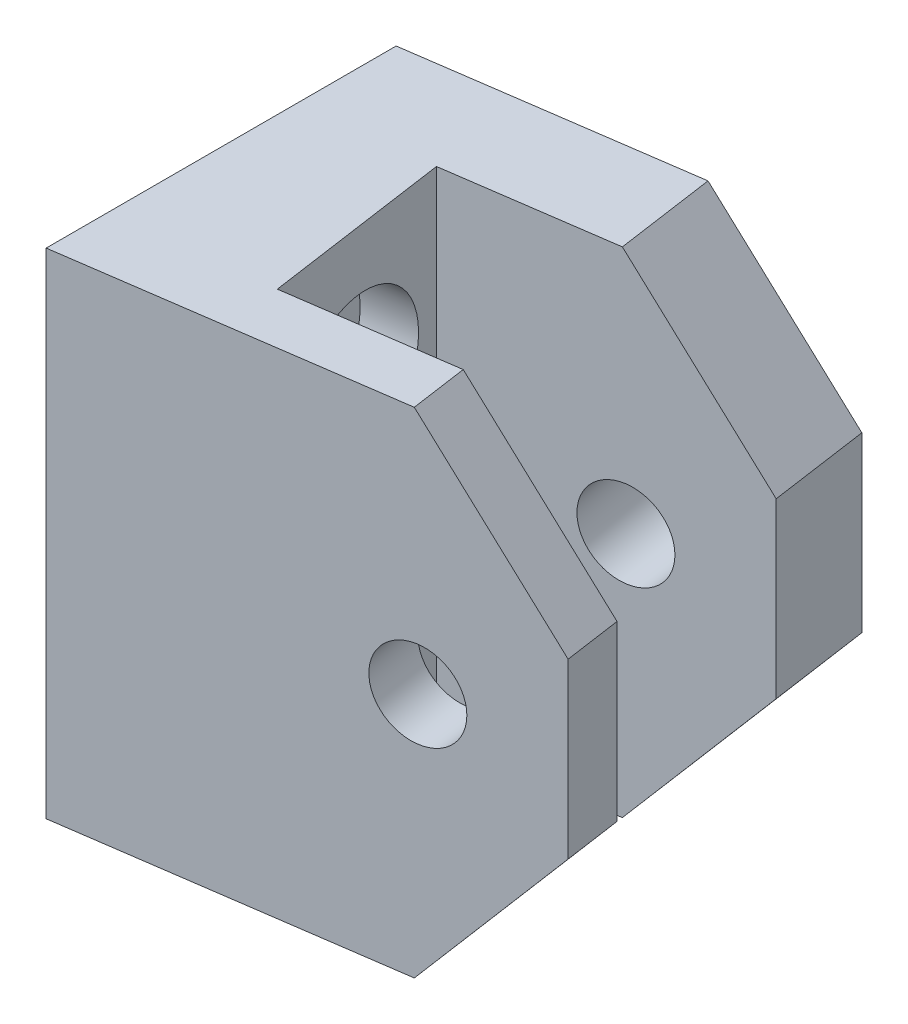
ISO-10303-21;
HEADER;
FILE_DESCRIPTION(('STEP AP214'),'2;1');
FILE_NAME('part.step','',(''),(''),'','','');
FILE_SCHEMA(('AUTOMOTIVE_DESIGN { 1 0 10303 214 1 1 1 1 }'));
ENDSEC;
DATA;
#1=APPLICATION_CONTEXT('core data for automotive mechanical design processes');
#2=APPLICATION_PROTOCOL_DEFINITION('international standard','automotive_design',2000,#1);
#3=PRODUCT_CONTEXT('',#1,'mechanical');
#4=PRODUCT('Part','Part','',(#3));
#5=PRODUCT_RELATED_PRODUCT_CATEGORY('part','',(#4));
#6=PRODUCT_DEFINITION_FORMATION('','',#4);
#7=PRODUCT_DEFINITION_CONTEXT('part definition',#1,'design');
#8=PRODUCT_DEFINITION('design','',#6,#7);
#9=PRODUCT_DEFINITION_SHAPE('','',#8);
#10=(LENGTH_UNIT() NAMED_UNIT(*) SI_UNIT(.MILLI.,.METRE.));
#11=(NAMED_UNIT(*) PLANE_ANGLE_UNIT() SI_UNIT($,.RADIAN.));
#12=(NAMED_UNIT(*) SI_UNIT($,.STERADIAN.) SOLID_ANGLE_UNIT());
#13=UNCERTAINTY_MEASURE_WITH_UNIT(LENGTH_MEASURE(1.E-05),#10,'distance_accuracy_value','');
#14=(GEOMETRIC_REPRESENTATION_CONTEXT(3) GLOBAL_UNCERTAINTY_ASSIGNED_CONTEXT((#13)) GLOBAL_UNIT_ASSIGNED_CONTEXT((#10,
#11,#12)) REPRESENTATION_CONTEXT('',''));
#15=CARTESIAN_POINT('',(0.,0.,0.));
#16=DIRECTION('',(0.,0.,1.));
#17=DIRECTION('',(1.,0.,0.));
#18=AXIS2_PLACEMENT_3D('',#15,#16,#17);
#19=CARTESIAN_POINT('',(-1.90500000579084,54.37886,33.9650340772844));
#20=DIRECTION('',(1.,0.,-8.04481674826941E-13));
#21=DIRECTION('',(-8.04481674826941E-13,0.,-1.));
#22=AXIS2_PLACEMENT_3D('',#19,#20,#21);
#23=PLANE('',#22);
#24=CARTESIAN_POINT('',(-1.9050000058044,39.88943,17.1191776297874));
#25=DIRECTION('',(1.,0.,-8.04481674826941E-13));
#26=DIRECTION('',(-8.04481674826941E-13,0.,-1.));
#27=AXIS2_PLACEMENT_3D('',#24,#25,#26);
#28=ELLIPSE('',#27,4.54608092387669,4.5);
#29=CARTESIAN_POINT('',(-1.90500000580805,39.88943,12.5730967059107));
#30=VERTEX_POINT('',#29);
#31=EDGE_CURVE('E49',#30,#30,#28,.T.);
#32=ORIENTED_EDGE('',*,*,#31,.T.);
#33=EDGE_LOOP('',(#32));
#34=FACE_BOUND('',#33,.T.);
#35=CARTESIAN_POINT('',(-1.9050000058044,14.48943,17.1191776297874));
#36=DIRECTION('',(1.,0.,-8.04481674826941E-13));
#37=DIRECTION('',(-8.04481674826941E-13,0.,-1.));
#38=AXIS2_PLACEMENT_3D('',#35,#36,#37);
#39=ELLIPSE('',#38,4.54608092387669,4.5);
#40=CARTESIAN_POINT('',(-1.90500000580805,14.48943,12.5730967059107));
#41=VERTEX_POINT('',#40);
#42=EDGE_CURVE('E211',#41,#41,#39,.T.);
#43=ORIENTED_EDGE('',*,*,#42,.T.);
#44=EDGE_LOOP('',(#43));
#45=FACE_BOUND('',#44,.T.);
#46=DIRECTION('',(8.04481674826941E-13,0.,1.));
#47=VECTOR('',#46,1.);
#48=CARTESIAN_POINT('',(-1.90500000579084,0.,33.9650340772844));
#49=LINE('',#48,#47);
#50=CARTESIAN_POINT('',(-1.90500000579084,0.,-4.5379477954834));
#51=VERTEX_POINT('',#50);
#52=CARTESIAN_POINT('',(-1.90500000579084,0.,33.9650340772844));
#53=VERTEX_POINT('',#52);
#54=EDGE_CURVE('E171',#51,#53,#49,.T.);
#55=ORIENTED_EDGE('',*,*,#54,.T.);
#56=DIRECTION('',(0.,-1.,0.));
#57=VECTOR('',#56,1.);
#58=CARTESIAN_POINT('',(-1.90500000579084,54.37886,33.9650340772844));
#59=LINE('',#58,#57);
#60=CARTESIAN_POINT('',(-1.90500000579084,54.37886,33.9650340772844));
#61=VERTEX_POINT('',#60);
#62=EDGE_CURVE('E203',#61,#53,#59,.T.);
#63=ORIENTED_EDGE('',*,*,#62,.F.);
#64=DIRECTION('',(0.,0.,1.));
#65=VECTOR('',#64,1.);
#66=CARTESIAN_POINT('',(-1.90500000579084,54.37886,-4.5379477954834));
#67=LINE('',#66,#65);
#68=CARTESIAN_POINT('',(-1.90500000579084,54.37886,-4.5379477954834));
#69=VERTEX_POINT('',#68);
#70=EDGE_CURVE('E154',#69,#61,#67,.T.);
#71=ORIENTED_EDGE('',*,*,#70,.F.);
#72=DIRECTION('',(0.,-1.,0.));
#73=VECTOR('',#72,1.);
#74=CARTESIAN_POINT('',(-1.90500000579084,54.37886,-4.5379477954834));
#75=LINE('',#74,#73);
#76=EDGE_CURVE('E170',#69,#51,#75,.T.);
#77=ORIENTED_EDGE('',*,*,#76,.T.);
#78=EDGE_LOOP('',(#55,#63,#71,#77));
#79=FACE_BOUND('',#78,.T.);
#80=ADVANCED_FACE('F46',(#34,#45,#79),#23,.F.);
#81=CARTESIAN_POINT('',(48.3131852579812,54.37886,26.7599455067536));
#82=DIRECTION('',(-0.142021357940423,0.,-0.989863593576791));
#83=DIRECTION('',(-0.989863593576791,0.,0.142021357940423));
#84=AXIS2_PLACEMENT_3D('',#81,#82,#83);
#85=PLANE('',#84);
#86=CARTESIAN_POINT('',(33.8562274737922,27.18943,28.8341674394736));
#87=DIRECTION('',(0.142021357940418,0.,0.989863593576792));
#88=DIRECTION('',(0.989863593576792,0.,-0.142021357940418));
#89=AXIS2_PLACEMENT_3D('',#86,#87,#88);
#90=CIRCLE('',#89,4.76249999681212);
#91=CARTESIAN_POINT('',(38.5704528350461,27.18943,28.1577907227351));
#92=VERTEX_POINT('',#91);
#93=EDGE_CURVE('E235',#92,#92,#90,.T.);
#94=ORIENTED_EDGE('',*,*,#93,.F.);
#95=EDGE_LOOP('',(#94));
#96=FACE_BOUND('',#95,.T.);
#97=DIRECTION('',(0.989863593576791,0.,-0.142021357940423));
#98=VECTOR('',#97,1.);
#99=CARTESIAN_POINT('',(48.3131852579812,0.,26.7599455067536));
#100=LINE('',#99,#98);
#101=CARTESIAN_POINT('',(33.513696223646,0.,28.8833123454973));
#102=VERTEX_POINT('',#101);
#103=EDGE_CURVE('E174',#53,#102,#100,.T.);
#104=ORIENTED_EDGE('',*,*,#103,.T.);
#105=DIRECTION('',(-0.639499728041495,-0.763296499953481,0.091752662051951));
#106=VECTOR('',#105,1.);
#107=CARTESIAN_POINT('',(48.3131852579813,17.66443,26.7599455067538));
#108=LINE('',#107,#106);
#109=CARTESIAN_POINT('',(48.3131852579813,17.66443,26.7599455067538));
#110=VERTEX_POINT('',#109);
#111=EDGE_CURVE('E213',#110,#102,#108,.T.);
#112=ORIENTED_EDGE('',*,*,#111,.F.);
#113=DIRECTION('',(0.,-1.,0.));
#114=VECTOR('',#113,1.);
#115=CARTESIAN_POINT('',(48.3131852579812,54.37886,26.7599455067536));
#116=LINE('',#115,#114);
#117=CARTESIAN_POINT('',(48.3131852579813,36.71443,26.7599455067538));
#118=VERTEX_POINT('',#117);
#119=EDGE_CURVE('E148',#118,#110,#116,.T.);
#120=ORIENTED_EDGE('',*,*,#119,.F.);
#121=DIRECTION('',(0.639499728041495,-0.763296499953481,-0.091752662051951));
#122=VECTOR('',#121,1.);
#123=CARTESIAN_POINT('',(48.3131852579813,36.71443,26.7599455067538));
#124=LINE('',#123,#122);
#125=CARTESIAN_POINT('',(33.513696223646,54.37886,28.8833123454975));
#126=VERTEX_POINT('',#125);
#127=EDGE_CURVE('E134',#126,#118,#124,.T.);
#128=ORIENTED_EDGE('',*,*,#127,.F.);
#129=DIRECTION('',(0.989863593576791,0.,-0.142021357940424));
#130=VECTOR('',#129,1.);
#131=CARTESIAN_POINT('',(-0.0215618187976437,54.37886,33.6948064917369));
#132=LINE('',#131,#130);
#133=EDGE_CURVE('E145',#61,#126,#132,.T.);
#134=ORIENTED_EDGE('',*,*,#133,.F.);
#135=ORIENTED_EDGE('',*,*,#62,.T.);
#136=EDGE_LOOP('',(#104,#112,#120,#128,#134,#135));
#137=FACE_BOUND('',#136,.T.);
#138=ADVANCED_FACE('F143',(#96,#137),#85,.F.);
#139=CARTESIAN_POINT('',(47.4113496350595,54.37886,20.474311687541));
#140=DIRECTION('',(-0.989863593576791,0.,0.142021357940424));
#141=DIRECTION('',(0.142021357940424,0.,0.989863593576791));
#142=AXIS2_PLACEMENT_3D('',#139,#140,#141);
#143=PLANE('',#142);
#144=ORIENTED_EDGE('',*,*,#119,.T.);
#145=DIRECTION('',(0.142021357940418,0.,0.989863593576792));
#146=VECTOR('',#145,1.);
#147=CARTESIAN_POINT('',(41.9966406174318,17.66443,-17.2652466724793));
#148=LINE('',#147,#146);
#149=CARTESIAN_POINT('',(47.4113496350596,17.66443,20.474311687541));
#150=VERTEX_POINT('',#149);
#151=EDGE_CURVE('E217',#150,#110,#148,.T.);
#152=ORIENTED_EDGE('',*,*,#151,.F.);
#153=DIRECTION('',(0.,-1.,0.));
#154=VECTOR('',#153,1.);
#155=CARTESIAN_POINT('',(47.4113496350595,54.37886,20.474311687541));
#156=LINE('',#155,#154);
#157=CARTESIAN_POINT('',(47.4113496350596,36.71443,20.474311687541));
#158=VERTEX_POINT('',#157);
#159=EDGE_CURVE('E199',#158,#150,#156,.T.);
#160=ORIENTED_EDGE('',*,*,#159,.F.);
#161=DIRECTION('',(0.142021357940418,0.,0.989863593576792));
#162=VECTOR('',#161,1.);
#163=CARTESIAN_POINT('',(41.9966406174318,36.71443,-17.2652466724793));
#164=LINE('',#163,#162);
#165=EDGE_CURVE('E149',#158,#118,#164,.T.);
#166=ORIENTED_EDGE('',*,*,#165,.T.);
#167=EDGE_LOOP('',(#144,#152,#160,#166));
#168=FACE_BOUND('',#167,.T.);
#169=ADVANCED_FACE('F279',(#168),#143,.F.);
#170=CARTESIAN_POINT('',(47.4113496350595,54.37886,20.474311687541));
#171=DIRECTION('',(0.142021357940423,0.,0.989863593576791));
#172=DIRECTION('',(0.989863593576791,0.,-0.142021357940423));
#173=AXIS2_PLACEMENT_3D('',#170,#171,#172);
#174=PLANE('',#173);
#175=CARTESIAN_POINT('',(32.9543918508706,27.18943,22.5485336202608));
#176=DIRECTION('',(0.142021357940423,0.,0.989863593576791));
#177=DIRECTION('',(0.989863593576791,0.,-0.142021357940423));
#178=AXIS2_PLACEMENT_3D('',#175,#176,#177);
#179=CIRCLE('',#178,4.76249999681212);
#180=CARTESIAN_POINT('',(37.6686172121245,27.18943,21.8721569035223));
#181=VERTEX_POINT('',#180);
#182=EDGE_CURVE('E175',#181,#181,#179,.T.);
#183=ORIENTED_EDGE('',*,*,#182,.T.);
#184=EDGE_LOOP('',(#183));
#185=FACE_BOUND('',#184,.T.);
#186=ORIENTED_EDGE('',*,*,#159,.T.);
#187=DIRECTION('',(-0.639499728041494,-0.763296499953481,0.091752662051954));
#188=VECTOR('',#187,1.);
#189=CARTESIAN_POINT('',(65.3326874024808,39.0550479979942,17.9030354608427));
#190=LINE('',#189,#188);
#191=CARTESIAN_POINT('',(32.6118606007243,0.,22.5976785262847));
#192=VERTEX_POINT('',#191);
#193=EDGE_CURVE('E244',#150,#192,#190,.T.);
#194=ORIENTED_EDGE('',*,*,#193,.T.);
#195=DIRECTION('',(-0.989863593576791,0.,0.142021357940423));
#196=VECTOR('',#195,1.);
#197=CARTESIAN_POINT('',(47.4113496350595,0.,20.474311687541));
#198=LINE('',#197,#196);
#199=CARTESIAN_POINT('',(14.7260537751539,0.,25.1638569267337));
#200=VERTEX_POINT('',#199);
#201=EDGE_CURVE('E177',#192,#200,#198,.T.);
#202=ORIENTED_EDGE('',*,*,#201,.T.);
#203=DIRECTION('',(0.,-1.,0.));
#204=VECTOR('',#203,1.);
#205=CARTESIAN_POINT('',(14.7260537751539,54.37886,25.1638569267337));
#206=LINE('',#205,#204);
#207=CARTESIAN_POINT('',(14.7260537751539,54.37886,25.1638569267337));
#208=VERTEX_POINT('',#207);
#209=EDGE_CURVE('E196',#208,#200,#206,.T.);
#210=ORIENTED_EDGE('',*,*,#209,.F.);
#211=DIRECTION('',(-0.989863593576791,0.,0.142021357940423));
#212=VECTOR('',#211,1.);
#213=CARTESIAN_POINT('',(47.4113496350595,54.37886,20.474311687541));
#214=LINE('',#213,#212);
#215=CARTESIAN_POINT('',(32.6118606007243,54.37886,22.5976785262847));
#216=VERTEX_POINT('',#215);
#217=EDGE_CURVE('E156',#216,#208,#214,.T.);
#218=ORIENTED_EDGE('',*,*,#217,.F.);
#219=DIRECTION('',(0.639499728041494,-0.763296499953481,-0.091752662051954));
#220=VECTOR('',#219,1.);
#221=CARTESIAN_POINT('',(38.7888484414153,47.0061075306687,21.7114309596412));
#222=LINE('',#221,#220);
#223=EDGE_CURVE('E70',#216,#158,#222,.T.);
#224=ORIENTED_EDGE('',*,*,#223,.T.);
#225=EDGE_LOOP('',(#186,#194,#202,#210,#218,#224));
#226=FACE_BOUND('',#225,.T.);
#227=ADVANCED_FACE('F256',(#185,#226),#174,.F.);
#228=CARTESIAN_POINT('',(14.7260537751539,54.37886,25.1638569267337));
#229=DIRECTION('',(-0.989863593576791,0.,0.142021357940423));
#230=DIRECTION('',(0.142021357940423,0.,0.989863593576791));
#231=AXIS2_PLACEMENT_3D('',#228,#229,#230);
#232=PLANE('',#231);
#233=CARTESIAN_POINT('',(13.2596690522831,39.88943,14.9434163366941));
#234=DIRECTION('',(0.989863593576792,0.,-0.142021357940418));
#235=DIRECTION('',(-0.142021357940418,0.,-0.989863593576792));
#236=AXIS2_PLACEMENT_3D('',#233,#234,#235);
#237=CIRCLE('',#236,8.);
#238=CARTESIAN_POINT('',(12.1234981887598,39.88943,7.02450758807973));
#239=VERTEX_POINT('',#238);
#240=EDGE_CURVE('E495',#239,#239,#237,.T.);
#241=ORIENTED_EDGE('',*,*,#240,.F.);
#242=EDGE_LOOP('',(#241));
#243=FACE_BOUND('',#242,.T.);
#244=CARTESIAN_POINT('',(13.2596690522831,14.48943,14.9434163366941));
#245=DIRECTION('',(0.989863593576792,0.,-0.142021357940418));
#246=DIRECTION('',(-0.142021357940418,0.,-0.989863593576792));
#247=AXIS2_PLACEMENT_3D('',#244,#245,#246);
#248=CIRCLE('',#247,8.);
#249=CARTESIAN_POINT('',(12.1234981887598,14.48943,7.02450758807973));
#250=VERTEX_POINT('',#249);
#251=EDGE_CURVE('E227',#250,#250,#248,.T.);
#252=ORIENTED_EDGE('',*,*,#251,.F.);
#253=EDGE_LOOP('',(#252));
#254=FACE_BOUND('',#253,.T.);
#255=DIRECTION('',(-0.142021357940423,0.,-0.989863593576791));
#256=VECTOR('',#255,1.);
#257=CARTESIAN_POINT('',(14.7260537751539,0.,25.1638569267337));
#258=LINE('',#257,#256);
#259=CARTESIAN_POINT('',(11.7932843294126,0.,4.72297574665434));
#260=VERTEX_POINT('',#259);
#261=EDGE_CURVE('E179',#200,#260,#258,.T.);
#262=ORIENTED_EDGE('',*,*,#261,.T.);
#263=DIRECTION('',(0.,-1.,0.));
#264=VECTOR('',#263,1.);
#265=CARTESIAN_POINT('',(11.7932843294126,54.37886,4.72297574665434));
#266=LINE('',#265,#264);
#267=CARTESIAN_POINT('',(11.7932843294126,54.37886,4.72297574665434));
#268=VERTEX_POINT('',#267);
#269=EDGE_CURVE('E193',#268,#260,#266,.T.);
#270=ORIENTED_EDGE('',*,*,#269,.F.);
#271=DIRECTION('',(-0.142021357940423,0.,-0.989863593576791));
#272=VECTOR('',#271,1.);
#273=CARTESIAN_POINT('',(14.7260537751539,54.37886,25.1638569267337));
#274=LINE('',#273,#272);
#275=EDGE_CURVE('E158',#208,#268,#274,.T.);
#276=ORIENTED_EDGE('',*,*,#275,.F.);
#277=ORIENTED_EDGE('',*,*,#209,.T.);
#278=EDGE_LOOP('',(#262,#270,#276,#277));
#279=FACE_BOUND('',#278,.T.);
#280=ADVANCED_FACE('F303',(#243,#254,#279),#232,.F.);
#281=CARTESIAN_POINT('',(11.7932843294126,54.37886,4.72297574665434));
#282=DIRECTION('',(-0.142021357940422,0.,-0.989863593576791));
#283=DIRECTION('',(-0.989863593576791,0.,0.142021357940422));
#284=AXIS2_PLACEMENT_3D('',#281,#282,#283);
#285=PLANE('',#284);
#286=CARTESIAN_POINT('',(30.0216224051293,27.18943,2.10765244018144));
#287=DIRECTION('',(-0.142021357940422,0.,-0.989863593576791));
#288=DIRECTION('',(-0.989863593576791,0.,0.142021357940422));
#289=AXIS2_PLACEMENT_3D('',#286,#287,#288);
#290=CIRCLE('',#289,4.76249999681212);
#291=CARTESIAN_POINT('',(25.3073970438754,27.18943,2.78402915691995));
#292=VERTEX_POINT('',#291);
#293=EDGE_CURVE('E210',#292,#292,#290,.T.);
#294=ORIENTED_EDGE('',*,*,#293,.T.);
#295=EDGE_LOOP('',(#294));
#296=FACE_BOUND('',#295,.T.);
#297=DIRECTION('',(0.989863593576791,0.,-0.142021357940422));
#298=VECTOR('',#297,1.);
#299=CARTESIAN_POINT('',(11.7932843294126,0.,4.72297574665434));
#300=LINE('',#299,#298);
#301=CARTESIAN_POINT('',(29.6790911549831,0.,2.15679734620532));
#302=VERTEX_POINT('',#301);
#303=EDGE_CURVE('E181',#260,#302,#300,.T.);
#304=ORIENTED_EDGE('',*,*,#303,.T.);
#305=DIRECTION('',(0.639499728041494,0.763296499953481,-0.0917526620519537));
#306=VECTOR('',#305,1.);
#307=CARTESIAN_POINT('',(48.7577797296956,22.7720131443677,-0.580530581284393));
#308=LINE('',#307,#306);
#309=CARTESIAN_POINT('',(44.4785801893184,17.66443,0.0334305074615772));
#310=VERTEX_POINT('',#309);
#311=EDGE_CURVE('E241',#302,#310,#308,.T.);
#312=ORIENTED_EDGE('',*,*,#311,.T.);
#313=DIRECTION('',(0.,-1.,0.));
#314=VECTOR('',#313,1.);
#315=CARTESIAN_POINT('',(44.4785801893182,54.37886,0.0334305074615998));
#316=LINE('',#315,#314);
#317=CARTESIAN_POINT('',(44.4785801893184,36.71443,0.0334305074615772));
#318=VERTEX_POINT('',#317);
#319=EDGE_CURVE('E190',#318,#310,#316,.T.);
#320=ORIENTED_EDGE('',*,*,#319,.F.);
#321=DIRECTION('',(-0.639499728041494,0.763296499953481,0.0917526620519537));
#322=VECTOR('',#321,1.);
#323=CARTESIAN_POINT('',(22.21394076863,63.2891423842952,3.22786491751417));
#324=LINE('',#323,#322);
#325=CARTESIAN_POINT('',(29.6790911549831,54.37886,2.15679734620532));
#326=VERTEX_POINT('',#325);
#327=EDGE_CURVE('E248',#318,#326,#324,.T.);
#328=ORIENTED_EDGE('',*,*,#327,.T.);
#329=DIRECTION('',(0.989863593576791,0.,-0.142021357940422));
#330=VECTOR('',#329,1.);
#331=CARTESIAN_POINT('',(11.7932843294126,54.37886,4.72297574665434));
#332=LINE('',#331,#330);
#333=EDGE_CURVE('E165',#268,#326,#332,.T.);
#334=ORIENTED_EDGE('',*,*,#333,.F.);
#335=ORIENTED_EDGE('',*,*,#269,.T.);
#336=EDGE_LOOP('',(#304,#312,#320,#328,#334,#335));
#337=FACE_BOUND('',#336,.T.);
#338=ADVANCED_FACE('F308',(#296,#337),#285,.F.);
#339=CARTESIAN_POINT('',(44.4785801893182,54.37886,0.0334305074615998));
#340=DIRECTION('',(-0.989863593576791,0.,0.142021357940424));
#341=DIRECTION('',(0.142021357940424,0.,0.989863593576791));
#342=AXIS2_PLACEMENT_3D('',#339,#340,#341);
#343=PLANE('',#342);
#344=ORIENTED_EDGE('',*,*,#319,.T.);
#345=CARTESIAN_POINT('',(42.9003678492055,17.66443,-10.9664286761605));
#346=VERTEX_POINT('',#345);
#347=EDGE_CURVE('E150',#346,#310,#148,.T.);
#348=ORIENTED_EDGE('',*,*,#347,.F.);
#349=DIRECTION('',(0.,-1.,0.));
#350=VECTOR('',#349,1.);
#351=CARTESIAN_POINT('',(42.9003678492052,54.37886,-10.9664286761605));
#352=LINE('',#351,#350);
#353=CARTESIAN_POINT('',(42.9003678492055,36.71443,-10.9664286761605));
#354=VERTEX_POINT('',#353);
#355=EDGE_CURVE('E187',#354,#346,#352,.T.);
#356=ORIENTED_EDGE('',*,*,#355,.F.);
#357=EDGE_CURVE('E232',#354,#318,#164,.T.);
#358=ORIENTED_EDGE('',*,*,#357,.T.);
#359=EDGE_LOOP('',(#344,#348,#356,#358));
#360=FACE_BOUND('',#359,.T.);
#361=ADVANCED_FACE('F312',(#360),#343,.F.);
#362=CARTESIAN_POINT('',(42.9003678492052,54.37886,-10.9664286761605));
#363=DIRECTION('',(0.142021357940423,0.,0.989863593576791));
#364=DIRECTION('',(0.989863593576791,0.,-0.142021357940423));
#365=AXIS2_PLACEMENT_3D('',#362,#363,#364);
#366=PLANE('',#365);
#367=CARTESIAN_POINT('',(28.4434100650164,27.18943,-8.89220674344066));
#368=DIRECTION('',(0.142021357940423,0.,0.989863593576791));
#369=DIRECTION('',(0.989863593576791,0.,-0.142021357940423));
#370=AXIS2_PLACEMENT_3D('',#367,#368,#369);
#371=CIRCLE('',#370,4.76249999681212);
#372=CARTESIAN_POINT('',(33.1576354262703,27.18943,-9.56858346017918));
#373=VERTEX_POINT('',#372);
#374=EDGE_CURVE('E208',#373,#373,#371,.T.);
#375=ORIENTED_EDGE('',*,*,#374,.T.);
#376=EDGE_LOOP('',(#375));
#377=FACE_BOUND('',#376,.T.);
#378=ORIENTED_EDGE('',*,*,#355,.T.);
#379=DIRECTION('',(-0.639499728041494,-0.763296499953481,0.0917526620519543));
#380=VECTOR('',#379,1.);
#381=CARTESIAN_POINT('',(60.8217056166267,39.0550479979941,-13.5377049028588));
#382=LINE('',#381,#380);
#383=CARTESIAN_POINT('',(28.1008788148702,0.,-8.84306183741677));
#384=VERTEX_POINT('',#383);
#385=EDGE_CURVE('E238',#346,#384,#382,.T.);
#386=ORIENTED_EDGE('',*,*,#385,.T.);
#387=DIRECTION('',(-0.989863593576791,0.,0.142021357940423));
#388=VECTOR('',#387,1.);
#389=CARTESIAN_POINT('',(42.9003678492052,0.,-10.9664286761605));
#390=LINE('',#389,#388);
#391=EDGE_CURVE('E160',#384,#51,#390,.T.);
#392=ORIENTED_EDGE('',*,*,#391,.T.);
#393=ORIENTED_EDGE('',*,*,#76,.F.);
#394=DIRECTION('',(-0.989863593576791,0.,0.142021357940423));
#395=VECTOR('',#394,1.);
#396=CARTESIAN_POINT('',(42.9003678492052,54.37886,-10.9664286761605));
#397=LINE('',#396,#395);
#398=CARTESIAN_POINT('',(28.1008788148702,54.37886,-8.84306183741677));
#399=VERTEX_POINT('',#398);
#400=EDGE_CURVE('E168',#399,#69,#397,.T.);
#401=ORIENTED_EDGE('',*,*,#400,.F.);
#402=DIRECTION('',(0.639499728041494,-0.763296499953481,-0.0917526620519543));
#403=VECTOR('',#402,1.);
#404=CARTESIAN_POINT('',(34.2778666555611,47.0061075306688,-9.72930940406025));
#405=LINE('',#404,#403);
#406=EDGE_CURVE('E62',#399,#354,#405,.T.);
#407=ORIENTED_EDGE('',*,*,#406,.T.);
#408=EDGE_LOOP('',(#378,#386,#392,#393,#401,#407));
#409=FACE_BOUND('',#408,.T.);
#410=ADVANCED_FACE('F316',(#377,#409),#366,.F.);
#411=CARTESIAN_POINT('',(0.,54.37886,0.));
#412=DIRECTION('',(0.,-1.,0.));
#413=DIRECTION('',(0.,0.,-1.));
#414=AXIS2_PLACEMENT_3D('',#411,#412,#413);
#415=PLANE('',#414);
#416=ORIENTED_EDGE('',*,*,#133,.T.);
#417=DIRECTION('',(-0.142021357940418,0.,-0.989863593576792));
#418=VECTOR('',#417,1.);
#419=CARTESIAN_POINT('',(28.7772555320615,54.37886,-4.12883647300715));
#420=LINE('',#419,#418);
#421=EDGE_CURVE('E12',#126,#216,#420,.T.);
#422=ORIENTED_EDGE('',*,*,#421,.T.);
#423=ORIENTED_EDGE('',*,*,#217,.T.);
#424=ORIENTED_EDGE('',*,*,#275,.T.);
#425=ORIENTED_EDGE('',*,*,#333,.T.);
#426=EDGE_CURVE('E54',#326,#399,#420,.T.);
#427=ORIENTED_EDGE('',*,*,#426,.T.);
#428=ORIENTED_EDGE('',*,*,#400,.T.);
#429=ORIENTED_EDGE('',*,*,#70,.T.);
#430=EDGE_LOOP('',(#416,#422,#423,#424,#425,#427,#428,#429));
#431=FACE_BOUND('',#430,.T.);
#432=ADVANCED_FACE('F152',(#431),#415,.F.);
#433=CARTESIAN_POINT('',(0.,0.,0.));
#434=DIRECTION('',(0.,-1.,0.));
#435=DIRECTION('',(0.,0.,-1.));
#436=AXIS2_PLACEMENT_3D('',#433,#434,#435);
#437=PLANE('',#436);
#438=DIRECTION('',(-0.142021357940418,0.,-0.989863593576792));
#439=VECTOR('',#438,1.);
#440=CARTESIAN_POINT('',(28.7772555320615,0.,-4.12883647300715));
#441=LINE('',#440,#439);
#442=EDGE_CURVE('E206',#102,#192,#441,.T.);
#443=ORIENTED_EDGE('',*,*,#442,.F.);
#444=ORIENTED_EDGE('',*,*,#103,.F.);
#445=ORIENTED_EDGE('',*,*,#54,.F.);
#446=ORIENTED_EDGE('',*,*,#391,.F.);
#447=EDGE_CURVE('E205',#302,#384,#441,.T.);
#448=ORIENTED_EDGE('',*,*,#447,.F.);
#449=ORIENTED_EDGE('',*,*,#303,.F.);
#450=ORIENTED_EDGE('',*,*,#261,.F.);
#451=ORIENTED_EDGE('',*,*,#201,.F.);
#452=EDGE_LOOP('',(#443,#444,#445,#446,#448,#449,#450,#451));
#453=FACE_BOUND('',#452,.T.);
#454=ADVANCED_FACE('F289',(#453),#437,.T.);
#455=CARTESIAN_POINT('',(41.9966406174318,17.66443,-17.2652466724793));
#456=DIRECTION('',(-0.75555941640854,0.646048336549801,0.108404405434562));
#457=DIRECTION('',(-0.649878147761172,-0.760038415517603,0.));
#458=AXIS2_PLACEMENT_3D('',#455,#456,#457);
#459=PLANE('',#458);
#460=ORIENTED_EDGE('',*,*,#447,.T.);
#461=ORIENTED_EDGE('',*,*,#385,.F.);
#462=ORIENTED_EDGE('',*,*,#347,.T.);
#463=ORIENTED_EDGE('',*,*,#311,.F.);
#464=EDGE_LOOP('',(#460,#461,#462,#463));
#465=FACE_BOUND('',#464,.T.);
#466=ADVANCED_FACE('F322',(#465),#459,.F.);
#467=ORIENTED_EDGE('',*,*,#151,.T.);
#468=ORIENTED_EDGE('',*,*,#111,.T.);
#469=ORIENTED_EDGE('',*,*,#442,.T.);
#470=ORIENTED_EDGE('',*,*,#193,.F.);
#471=EDGE_LOOP('',(#467,#468,#469,#470));
#472=FACE_BOUND('',#471,.T.);
#473=ADVANCED_FACE('F293',(#472),#459,.F.);
#474=CARTESIAN_POINT('',(41.9966406174318,36.71443,-17.2652466724793));
#475=DIRECTION('',(-0.75555941640854,-0.646048336549801,0.108404405434562));
#476=DIRECTION('',(0.649878147761172,-0.760038415517603,0.));
#477=AXIS2_PLACEMENT_3D('',#474,#475,#476);
#478=PLANE('',#477);
#479=ORIENTED_EDGE('',*,*,#357,.F.);
#480=ORIENTED_EDGE('',*,*,#406,.F.);
#481=ORIENTED_EDGE('',*,*,#426,.F.);
#482=ORIENTED_EDGE('',*,*,#327,.F.);
#483=EDGE_LOOP('',(#479,#480,#481,#482));
#484=FACE_BOUND('',#483,.T.);
#485=ADVANCED_FACE('F343',(#484),#478,.F.);
#486=ORIENTED_EDGE('',*,*,#421,.F.);
#487=ORIENTED_EDGE('',*,*,#127,.T.);
#488=ORIENTED_EDGE('',*,*,#165,.F.);
#489=ORIENTED_EDGE('',*,*,#223,.F.);
#490=EDGE_LOOP('',(#486,#487,#488,#489));
#491=FACE_BOUND('',#490,.T.);
#492=ADVANCED_FACE('F133',(#491),#478,.F.);
#493=CARTESIAN_POINT('',(27.5396828332427,27.18943,-15.1910247397595));
#494=DIRECTION('',(0.142021357940418,0.,0.989863593576792));
#495=DIRECTION('',(0.989863593576792,0.,-0.142021357940418));
#496=AXIS2_PLACEMENT_3D('',#493,#494,#495);
#497=CYLINDRICAL_SURFACE('',#496,4.76249999681212);
#498=ORIENTED_EDGE('',*,*,#374,.F.);
#499=EDGE_LOOP('',(#498));
#500=FACE_BOUND('',#499,.T.);
#501=ORIENTED_EDGE('',*,*,#293,.F.);
#502=EDGE_LOOP('',(#501));
#503=FACE_BOUND('',#502,.T.);
#504=ADVANCED_FACE('F262',(#500,#503),#497,.F.);
#505=ORIENTED_EDGE('',*,*,#93,.T.);
#506=EDGE_LOOP('',(#505));
#507=FACE_BOUND('',#506,.T.);
#508=ORIENTED_EDGE('',*,*,#182,.F.);
#509=EDGE_LOOP('',(#508));
#510=FACE_BOUND('',#509,.T.);
#511=ADVANCED_FACE('F259',(#507,#510),#497,.F.);
#512=CARTESIAN_POINT('',(13.2596690522831,14.48943,14.9434163366941));
#513=DIRECTION('',(0.989863593576792,0.,-0.142021357940418));
#514=DIRECTION('',(-0.142021357940418,0.,-0.989863593576792));
#515=AXIS2_PLACEMENT_3D('',#512,#513,#514);
#516=CYLINDRICAL_SURFACE('',#515,4.5);
#517=CARTESIAN_POINT('',(7.63724384076696,14.48943,15.7500976497956));
#518=DIRECTION('',(0.989863593576792,0.,-0.142021357940418));
#519=DIRECTION('',(-0.142021357940418,0.,-0.989863593576792));
#520=AXIS2_PLACEMENT_3D('',#517,#518,#519);
#521=CIRCLE('',#520,4.5);
#522=CARTESIAN_POINT('',(6.99814773003508,14.48943,11.2957114787001));
#523=VERTEX_POINT('',#522);
#524=EDGE_CURVE('E214',#523,#523,#521,.T.);
#525=ORIENTED_EDGE('',*,*,#524,.T.);
#526=EDGE_LOOP('',(#525));
#527=FACE_BOUND('',#526,.T.);
#528=ORIENTED_EDGE('',*,*,#42,.F.);
#529=EDGE_LOOP('',(#528));
#530=FACE_BOUND('',#529,.T.);
#531=ADVANCED_FACE('F261',(#527,#530),#516,.F.);
#532=CARTESIAN_POINT('',(7.63724384076697,18.98943,15.7500976497956));
#533=DIRECTION('',(-0.989863593576792,0.,0.142021357940418));
#534=DIRECTION('',(0.142021357940418,0.,0.989863593576792));
#535=AXIS2_PLACEMENT_3D('',#532,#533,#534);
#536=PLANE('',#535);
#537=ORIENTED_EDGE('',*,*,#524,.F.);
#538=EDGE_LOOP('',(#537));
#539=FACE_BOUND('',#538,.T.);
#540=CARTESIAN_POINT('',(7.63724384076696,14.48943,15.7500976497956));
#541=DIRECTION('',(0.989863593576792,0.,-0.142021357940418));
#542=DIRECTION('',(-0.142021357940418,0.,-0.989863593576792));
#543=AXIS2_PLACEMENT_3D('',#540,#541,#542);
#544=CIRCLE('',#543,8.);
#545=CARTESIAN_POINT('',(6.50107297724362,14.48943,7.83118890118131));
#546=VERTEX_POINT('',#545);
#547=EDGE_CURVE('E221',#546,#546,#544,.T.);
#548=ORIENTED_EDGE('',*,*,#547,.T.);
#549=EDGE_LOOP('',(#548));
#550=FACE_BOUND('',#549,.T.);
#551=ADVANCED_FACE('F269',(#539,#550),#536,.F.);
#552=CARTESIAN_POINT('',(13.2596690522831,14.48943,14.9434163366941));
#553=DIRECTION('',(0.989863593576792,0.,-0.142021357940418));
#554=DIRECTION('',(-0.142021357940418,0.,-0.989863593576792));
#555=AXIS2_PLACEMENT_3D('',#552,#553,#554);
#556=CYLINDRICAL_SURFACE('',#555,8.);
#557=ORIENTED_EDGE('',*,*,#547,.F.);
#558=EDGE_LOOP('',(#557));
#559=FACE_BOUND('',#558,.T.);
#560=ORIENTED_EDGE('',*,*,#251,.T.);
#561=EDGE_LOOP('',(#560));
#562=FACE_BOUND('',#561,.T.);
#563=ADVANCED_FACE('F445',(#559,#562),#556,.F.);
#564=CARTESIAN_POINT('',(13.2596690522831,39.88943,14.9434163366941));
#565=DIRECTION('',(0.989863593576792,0.,-0.142021357940418));
#566=DIRECTION('',(-0.142021357940418,0.,-0.989863593576792));
#567=AXIS2_PLACEMENT_3D('',#564,#565,#566);
#568=CYLINDRICAL_SURFACE('',#567,4.5);
#569=CARTESIAN_POINT('',(7.63724384076696,39.88943,15.7500976497956));
#570=DIRECTION('',(0.989863593576792,0.,-0.142021357940418));
#571=DIRECTION('',(-0.142021357940418,0.,-0.989863593576792));
#572=AXIS2_PLACEMENT_3D('',#569,#570,#571);
#573=CIRCLE('',#572,4.5);
#574=CARTESIAN_POINT('',(6.99814773003508,39.88943,11.2957114787001));
#575=VERTEX_POINT('',#574);
#576=EDGE_CURVE('E497',#575,#575,#573,.T.);
#577=ORIENTED_EDGE('',*,*,#576,.T.);
#578=EDGE_LOOP('',(#577));
#579=FACE_BOUND('',#578,.T.);
#580=ORIENTED_EDGE('',*,*,#31,.F.);
#581=EDGE_LOOP('',(#580));
#582=FACE_BOUND('',#581,.T.);
#583=ADVANCED_FACE('F454',(#579,#582),#568,.F.);
#584=CARTESIAN_POINT('',(7.63724384076697,44.38943,15.7500976497956));
#585=DIRECTION('',(-0.989863593576792,0.,0.142021357940418));
#586=DIRECTION('',(0.142021357940418,0.,0.989863593576792));
#587=AXIS2_PLACEMENT_3D('',#584,#585,#586);
#588=PLANE('',#587);
#589=ORIENTED_EDGE('',*,*,#576,.F.);
#590=EDGE_LOOP('',(#589));
#591=FACE_BOUND('',#590,.T.);
#592=CARTESIAN_POINT('',(7.63724384076696,39.88943,15.7500976497956));
#593=DIRECTION('',(0.989863593576792,0.,-0.142021357940418));
#594=DIRECTION('',(-0.142021357940418,0.,-0.989863593576792));
#595=AXIS2_PLACEMENT_3D('',#592,#593,#594);
#596=CIRCLE('',#595,8.);
#597=CARTESIAN_POINT('',(6.50107297724362,39.88943,7.83118890118131));
#598=VERTEX_POINT('',#597);
#599=EDGE_CURVE('E492',#598,#598,#596,.T.);
#600=ORIENTED_EDGE('',*,*,#599,.T.);
#601=EDGE_LOOP('',(#600));
#602=FACE_BOUND('',#601,.T.);
#603=ADVANCED_FACE('F463',(#591,#602),#588,.F.);
#604=CARTESIAN_POINT('',(13.2596690522831,39.88943,14.9434163366941));
#605=DIRECTION('',(0.989863593576792,0.,-0.142021357940418));
#606=DIRECTION('',(-0.142021357940418,0.,-0.989863593576792));
#607=AXIS2_PLACEMENT_3D('',#604,#605,#606);
#608=CYLINDRICAL_SURFACE('',#607,8.);
#609=ORIENTED_EDGE('',*,*,#599,.F.);
#610=EDGE_LOOP('',(#609));
#611=FACE_BOUND('',#610,.T.);
#612=ORIENTED_EDGE('',*,*,#240,.T.);
#613=EDGE_LOOP('',(#612));
#614=FACE_BOUND('',#613,.T.);
#615=ADVANCED_FACE('F472',(#611,#614),#608,.F.);
#616=CLOSED_SHELL('',(#80,#138,#169,#227,#280,#338,#361,#410,#432,#454,#466,#473,#485,#492,#504,
#511,#531,#551,#563,#583,#603,#615));
#617=MANIFOLD_SOLID_BREP('B2',#616);
#618=ADVANCED_BREP_SHAPE_REPRESENTATION('',(#18,#617),#14);
#619=SHAPE_DEFINITION_REPRESENTATION(#9,#618);
ENDSEC;
END-ISO-10303-21;
